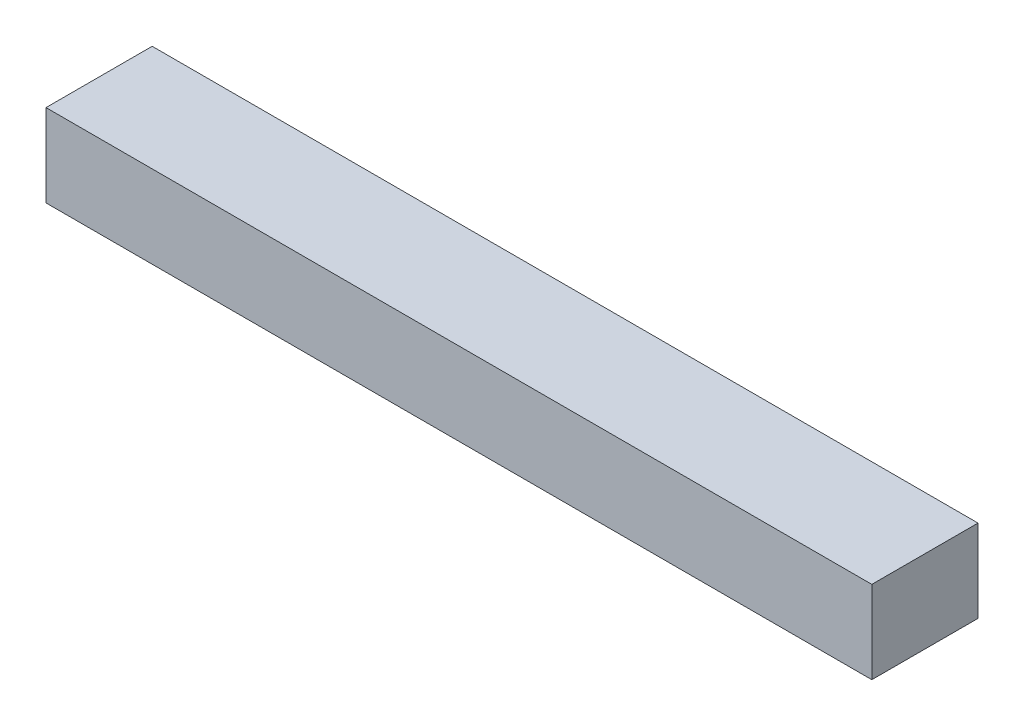
ISO-10303-21;
HEADER;
FILE_DESCRIPTION(('STEP AP214'),'2;1');
FILE_NAME('part.step','',(''),(''),'','','');
FILE_SCHEMA(('AUTOMOTIVE_DESIGN { 1 0 10303 214 1 1 1 1 }'));
ENDSEC;
DATA;
#1=APPLICATION_CONTEXT('core data for automotive mechanical design processes');
#2=APPLICATION_PROTOCOL_DEFINITION('international standard','automotive_design',2000,#1);
#3=PRODUCT_CONTEXT('',#1,'mechanical');
#4=PRODUCT('Part','Part','',(#3));
#5=PRODUCT_RELATED_PRODUCT_CATEGORY('part','',(#4));
#6=PRODUCT_DEFINITION_FORMATION('','',#4);
#7=PRODUCT_DEFINITION_CONTEXT('part definition',#1,'design');
#8=PRODUCT_DEFINITION('design','',#6,#7);
#9=PRODUCT_DEFINITION_SHAPE('','',#8);
#10=(LENGTH_UNIT() NAMED_UNIT(*) SI_UNIT(.MILLI.,.METRE.));
#11=(NAMED_UNIT(*) PLANE_ANGLE_UNIT() SI_UNIT($,.RADIAN.));
#12=(NAMED_UNIT(*) SI_UNIT($,.STERADIAN.) SOLID_ANGLE_UNIT());
#13=UNCERTAINTY_MEASURE_WITH_UNIT(LENGTH_MEASURE(1.E-05),#10,'distance_accuracy_value','');
#14=(GEOMETRIC_REPRESENTATION_CONTEXT(3) GLOBAL_UNCERTAINTY_ASSIGNED_CONTEXT((#13)) GLOBAL_UNIT_ASSIGNED_CONTEXT((#10,
#11,#12)) REPRESENTATION_CONTEXT('',''));
#15=CARTESIAN_POINT('',(0.,0.,0.));
#16=DIRECTION('',(0.,0.,1.));
#17=DIRECTION('',(1.,0.,0.));
#18=AXIS2_PLACEMENT_3D('',#15,#16,#17);
#19=CARTESIAN_POINT('',(0.,7.,0.));
#20=DIRECTION('',(1.,0.,0.));
#21=DIRECTION('',(0.,0.,-1.));
#22=AXIS2_PLACEMENT_3D('',#19,#20,#21);
#23=PLANE('',#22);
#24=DIRECTION('',(0.,0.,1.));
#25=VECTOR('',#24,1.);
#26=CARTESIAN_POINT('',(0.,0.,0.));
#27=LINE('',#26,#25);
#28=CARTESIAN_POINT('',(0.,0.,-9.));
#29=VERTEX_POINT('',#28);
#30=CARTESIAN_POINT('',(0.,0.,0.));
#31=VERTEX_POINT('',#30);
#32=EDGE_CURVE('E96',#29,#31,#27,.T.);
#33=ORIENTED_EDGE('',*,*,#32,.T.);
#34=DIRECTION('',(0.,-1.,0.));
#35=VECTOR('',#34,1.);
#36=CARTESIAN_POINT('',(0.,7.,0.));
#37=LINE('',#36,#35);
#38=CARTESIAN_POINT('',(0.,7.,0.));
#39=VERTEX_POINT('',#38);
#40=EDGE_CURVE('E11',#39,#31,#37,.T.);
#41=ORIENTED_EDGE('',*,*,#40,.F.);
#42=DIRECTION('',(0.,0.,1.));
#43=VECTOR('',#42,1.);
#44=CARTESIAN_POINT('',(0.,7.,0.));
#45=LINE('',#44,#43);
#46=CARTESIAN_POINT('',(0.,7.,-9.));
#47=VERTEX_POINT('',#46);
#48=EDGE_CURVE('E84',#47,#39,#45,.T.);
#49=ORIENTED_EDGE('',*,*,#48,.F.);
#50=DIRECTION('',(0.,-1.,0.));
#51=VECTOR('',#50,1.);
#52=CARTESIAN_POINT('',(0.,7.,-9.));
#53=LINE('',#52,#51);
#54=EDGE_CURVE('E92',#47,#29,#53,.T.);
#55=ORIENTED_EDGE('',*,*,#54,.T.);
#56=EDGE_LOOP('',(#33,#41,#49,#55));
#57=FACE_BOUND('',#56,.T.);
#58=ADVANCED_FACE('F33',(#57),#23,.F.);
#59=CARTESIAN_POINT('',(0.,7.,0.));
#60=DIRECTION('',(0.,0.,-1.));
#61=DIRECTION('',(-1.,0.,0.));
#62=AXIS2_PLACEMENT_3D('',#59,#60,#61);
#63=PLANE('',#62);
#64=DIRECTION('',(1.,0.,0.));
#65=VECTOR('',#64,1.);
#66=CARTESIAN_POINT('',(0.,0.,0.));
#67=LINE('',#66,#65);
#68=CARTESIAN_POINT('',(70.,0.,0.));
#69=VERTEX_POINT('',#68);
#70=EDGE_CURVE('E88',#31,#69,#67,.T.);
#71=ORIENTED_EDGE('',*,*,#70,.T.);
#72=DIRECTION('',(0.,-1.,0.));
#73=VECTOR('',#72,1.);
#74=CARTESIAN_POINT('',(70.,7.,0.));
#75=LINE('',#74,#73);
#76=CARTESIAN_POINT('',(70.,7.,0.));
#77=VERTEX_POINT('',#76);
#78=EDGE_CURVE('E41',#77,#69,#75,.T.);
#79=ORIENTED_EDGE('',*,*,#78,.F.);
#80=DIRECTION('',(1.,0.,0.));
#81=VECTOR('',#80,1.);
#82=CARTESIAN_POINT('',(0.,7.,0.));
#83=LINE('',#82,#81);
#84=EDGE_CURVE('E79',#39,#77,#83,.T.);
#85=ORIENTED_EDGE('',*,*,#84,.F.);
#86=ORIENTED_EDGE('',*,*,#40,.T.);
#87=EDGE_LOOP('',(#71,#79,#85,#86));
#88=FACE_BOUND('',#87,.T.);
#89=ADVANCED_FACE('F87',(#88),#63,.F.);
#90=CARTESIAN_POINT('',(70.,7.,0.));
#91=DIRECTION('',(-1.,0.,0.));
#92=DIRECTION('',(0.,0.,1.));
#93=AXIS2_PLACEMENT_3D('',#90,#91,#92);
#94=PLANE('',#93);
#95=DIRECTION('',(0.,0.,-1.));
#96=VECTOR('',#95,1.);
#97=CARTESIAN_POINT('',(70.,0.,0.));
#98=LINE('',#97,#96);
#99=CARTESIAN_POINT('',(70.,0.,-9.));
#100=VERTEX_POINT('',#99);
#101=EDGE_CURVE('E66',#69,#100,#98,.T.);
#102=ORIENTED_EDGE('',*,*,#101,.T.);
#103=DIRECTION('',(0.,-1.,0.));
#104=VECTOR('',#103,1.);
#105=CARTESIAN_POINT('',(70.,7.,-9.));
#106=LINE('',#105,#104);
#107=CARTESIAN_POINT('',(70.,7.,-9.));
#108=VERTEX_POINT('',#107);
#109=EDGE_CURVE('E89',#108,#100,#106,.T.);
#110=ORIENTED_EDGE('',*,*,#109,.F.);
#111=DIRECTION('',(0.,0.,-1.));
#112=VECTOR('',#111,1.);
#113=CARTESIAN_POINT('',(70.,7.,0.));
#114=LINE('',#113,#112);
#115=EDGE_CURVE('E82',#77,#108,#114,.T.);
#116=ORIENTED_EDGE('',*,*,#115,.F.);
#117=ORIENTED_EDGE('',*,*,#78,.T.);
#118=EDGE_LOOP('',(#102,#110,#116,#117));
#119=FACE_BOUND('',#118,.T.);
#120=ADVANCED_FACE('F90',(#119),#94,.F.);
#121=CARTESIAN_POINT('',(0.,7.,-9.));
#122=DIRECTION('',(0.,0.,1.));
#123=DIRECTION('',(1.,0.,0.));
#124=AXIS2_PLACEMENT_3D('',#121,#122,#123);
#125=PLANE('',#124);
#126=DIRECTION('',(-1.,0.,0.));
#127=VECTOR('',#126,1.);
#128=CARTESIAN_POINT('',(0.,0.,-9.));
#129=LINE('',#128,#127);
#130=EDGE_CURVE('E72',#100,#29,#129,.T.);
#131=ORIENTED_EDGE('',*,*,#130,.T.);
#132=ORIENTED_EDGE('',*,*,#54,.F.);
#133=DIRECTION('',(-1.,0.,0.));
#134=VECTOR('',#133,1.);
#135=CARTESIAN_POINT('',(0.,7.,-9.));
#136=LINE('',#135,#134);
#137=EDGE_CURVE('E49',#108,#47,#136,.T.);
#138=ORIENTED_EDGE('',*,*,#137,.F.);
#139=ORIENTED_EDGE('',*,*,#109,.T.);
#140=EDGE_LOOP('',(#131,#132,#138,#139));
#141=FACE_BOUND('',#140,.T.);
#142=ADVANCED_FACE('F103',(#141),#125,.F.);
#143=CARTESIAN_POINT('',(0.,7.,0.));
#144=DIRECTION('',(0.,-1.,0.));
#145=DIRECTION('',(0.,0.,-1.));
#146=AXIS2_PLACEMENT_3D('',#143,#144,#145);
#147=PLANE('',#146);
#148=ORIENTED_EDGE('',*,*,#48,.T.);
#149=ORIENTED_EDGE('',*,*,#84,.T.);
#150=ORIENTED_EDGE('',*,*,#115,.T.);
#151=ORIENTED_EDGE('',*,*,#137,.T.);
#152=EDGE_LOOP('',(#148,#149,#150,#151));
#153=FACE_BOUND('',#152,.T.);
#154=ADVANCED_FACE('F80',(#153),#147,.F.);
#155=CARTESIAN_POINT('',(0.,0.,0.));
#156=DIRECTION('',(0.,-1.,0.));
#157=DIRECTION('',(0.,0.,-1.));
#158=AXIS2_PLACEMENT_3D('',#155,#156,#157);
#159=PLANE('',#158);
#160=ORIENTED_EDGE('',*,*,#32,.F.);
#161=ORIENTED_EDGE('',*,*,#130,.F.);
#162=ORIENTED_EDGE('',*,*,#101,.F.);
#163=ORIENTED_EDGE('',*,*,#70,.F.);
#164=EDGE_LOOP('',(#160,#161,#162,#163));
#165=FACE_BOUND('',#164,.T.);
#166=ADVANCED_FACE('F106',(#165),#159,.T.);
#167=CLOSED_SHELL('',(#58,#89,#120,#142,#154,#166));
#168=MANIFOLD_SOLID_BREP('B2',#167);
#169=ADVANCED_BREP_SHAPE_REPRESENTATION('',(#18,#168),#14);
#170=SHAPE_DEFINITION_REPRESENTATION(#9,#169);
ENDSEC;
END-ISO-10303-21;
